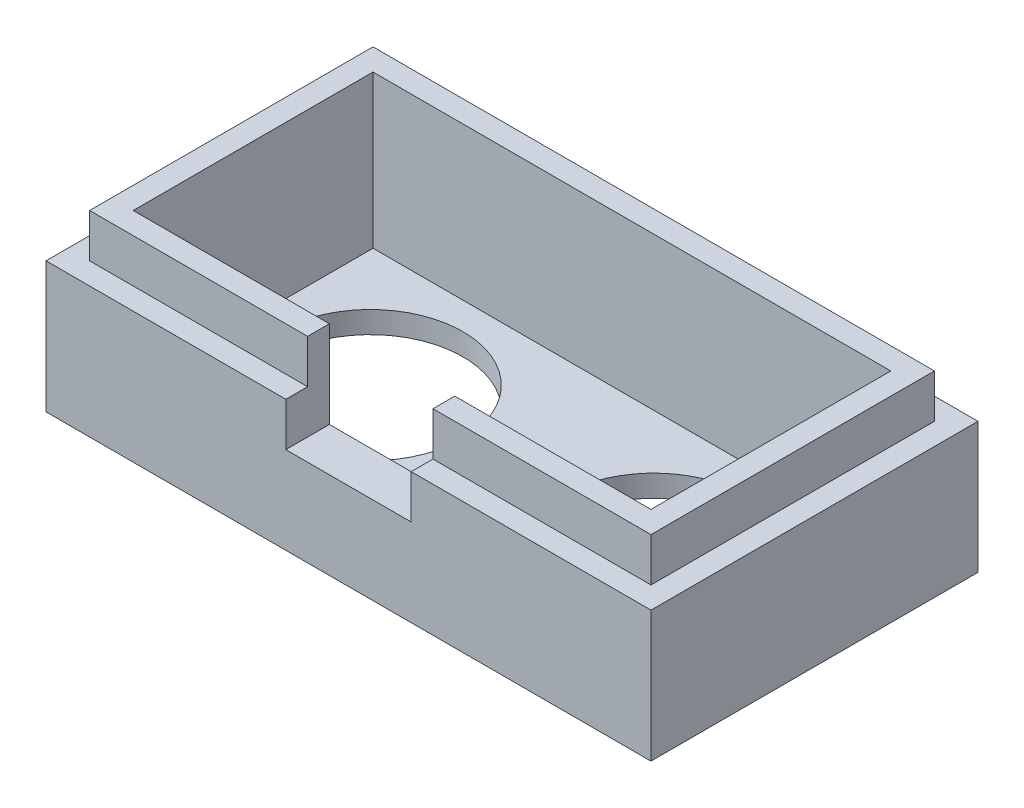
ISO-10303-21;
HEADER;
FILE_DESCRIPTION(('STEP AP214'),'2;1');
FILE_NAME('part.step','',(''),(''),'','','');
FILE_SCHEMA(('AUTOMOTIVE_DESIGN { 1 0 10303 214 1 1 1 1 }'));
ENDSEC;
DATA;
#1=APPLICATION_CONTEXT('core data for automotive mechanical design processes');
#2=APPLICATION_PROTOCOL_DEFINITION('international standard','automotive_design',2000,#1);
#3=PRODUCT_CONTEXT('',#1,'mechanical');
#4=PRODUCT('Part','Part','',(#3));
#5=PRODUCT_RELATED_PRODUCT_CATEGORY('part','',(#4));
#6=PRODUCT_DEFINITION_FORMATION('','',#4);
#7=PRODUCT_DEFINITION_CONTEXT('part definition',#1,'design');
#8=PRODUCT_DEFINITION('design','',#6,#7);
#9=PRODUCT_DEFINITION_SHAPE('','',#8);
#10=(LENGTH_UNIT() NAMED_UNIT(*) SI_UNIT(.MILLI.,.METRE.));
#11=(NAMED_UNIT(*) PLANE_ANGLE_UNIT() SI_UNIT($,.RADIAN.));
#12=(NAMED_UNIT(*) SI_UNIT($,.STERADIAN.) SOLID_ANGLE_UNIT());
#13=UNCERTAINTY_MEASURE_WITH_UNIT(LENGTH_MEASURE(1.E-05),#10,'distance_accuracy_value','');
#14=(GEOMETRIC_REPRESENTATION_CONTEXT(3) GLOBAL_UNCERTAINTY_ASSIGNED_CONTEXT((#13)) GLOBAL_UNIT_ASSIGNED_CONTEXT((#10,
#11,#12)) REPRESENTATION_CONTEXT('',''));
#15=CARTESIAN_POINT('',(0.,0.,0.));
#16=DIRECTION('',(0.,0.,1.));
#17=DIRECTION('',(1.,0.,0.));
#18=AXIS2_PLACEMENT_3D('',#15,#16,#17);
#19=CARTESIAN_POINT('',(0.,16.,13.));
#20=DIRECTION('',(0.,0.,1.));
#21=DIRECTION('',(1.,0.,0.));
#22=AXIS2_PLACEMENT_3D('',#19,#20,#21);
#23=PLANE('',#22);
#24=DIRECTION('',(0.,-1.,0.));
#25=VECTOR('',#24,1.);
#26=CARTESIAN_POINT('',(-5.75,16.,13.));
#27=LINE('',#26,#25);
#28=CARTESIAN_POINT('',(-5.75,16.,13.));
#29=VERTEX_POINT('',#28);
#30=CARTESIAN_POINT('',(-5.75,12.,13.));
#31=VERTEX_POINT('',#30);
#32=EDGE_CURVE('E192',#29,#31,#27,.T.);
#33=ORIENTED_EDGE('',*,*,#32,.F.);
#34=DIRECTION('',(-1.,0.,0.));
#35=VECTOR('',#34,1.);
#36=CARTESIAN_POINT('',(0.,16.,13.));
#37=LINE('',#36,#35);
#38=CARTESIAN_POINT('',(-25.75,16.,13.));
#39=VERTEX_POINT('',#38);
#40=EDGE_CURVE('E251',#29,#39,#37,.T.);
#41=ORIENTED_EDGE('',*,*,#40,.T.);
#42=DIRECTION('',(0.,-1.,0.));
#43=VECTOR('',#42,1.);
#44=CARTESIAN_POINT('',(-25.75,16.,13.));
#45=LINE('',#44,#43);
#46=CARTESIAN_POINT('',(-25.75,12.,13.));
#47=VERTEX_POINT('',#46);
#48=EDGE_CURVE('E264',#39,#47,#45,.T.);
#49=ORIENTED_EDGE('',*,*,#48,.T.);
#50=DIRECTION('',(-1.,0.,0.));
#51=VECTOR('',#50,1.);
#52=CARTESIAN_POINT('',(0.,12.,13.));
#53=LINE('',#52,#51);
#54=EDGE_CURVE('E200',#31,#47,#53,.T.);
#55=ORIENTED_EDGE('',*,*,#54,.F.);
#56=EDGE_LOOP('',(#33,#41,#49,#55));
#57=FACE_BOUND('',#56,.T.);
#58=ADVANCED_FACE('F32',(#57),#23,.T.);
#59=CARTESIAN_POINT('',(-13.,2.,0.));
#60=DIRECTION('',(0.,-1.,0.));
#61=DIRECTION('',(0.,0.,-1.));
#62=AXIS2_PLACEMENT_3D('',#59,#60,#61);
#63=CYLINDRICAL_SURFACE('',#62,8.5);
#64=CARTESIAN_POINT('',(-13.,2.,0.));
#65=DIRECTION('',(0.,1.,0.));
#66=DIRECTION('',(0.,0.,1.));
#67=AXIS2_PLACEMENT_3D('',#64,#65,#66);
#68=CIRCLE('',#67,8.5);
#69=CARTESIAN_POINT('',(-13.,2.,8.5));
#70=VERTEX_POINT('',#69);
#71=EDGE_CURVE('E296',#70,#70,#68,.T.);
#72=ORIENTED_EDGE('',*,*,#71,.T.);
#73=EDGE_LOOP('',(#72));
#74=FACE_BOUND('',#73,.T.);
#75=CARTESIAN_POINT('',(-13.,0.,0.));
#76=DIRECTION('',(0.,1.,0.));
#77=DIRECTION('',(0.,0.,1.));
#78=AXIS2_PLACEMENT_3D('',#75,#76,#77);
#79=CIRCLE('',#78,8.5);
#80=CARTESIAN_POINT('',(-13.,0.,8.5));
#81=VERTEX_POINT('',#80);
#82=EDGE_CURVE('E275',#81,#81,#79,.T.);
#83=ORIENTED_EDGE('',*,*,#82,.F.);
#84=EDGE_LOOP('',(#83));
#85=FACE_BOUND('',#84,.T.);
#86=ADVANCED_FACE('F34',(#74,#85),#63,.F.);
#87=CARTESIAN_POINT('',(13.,2.,0.));
#88=DIRECTION('',(0.,-1.,0.));
#89=DIRECTION('',(0.,0.,-1.));
#90=AXIS2_PLACEMENT_3D('',#87,#88,#89);
#91=CYLINDRICAL_SURFACE('',#90,8.5);
#92=CARTESIAN_POINT('',(13.,2.,0.));
#93=DIRECTION('',(0.,1.,0.));
#94=DIRECTION('',(0.,0.,1.));
#95=AXIS2_PLACEMENT_3D('',#92,#93,#94);
#96=CIRCLE('',#95,8.5);
#97=CARTESIAN_POINT('',(13.,2.,8.5));
#98=VERTEX_POINT('',#97);
#99=EDGE_CURVE('E299',#98,#98,#96,.F.);
#100=ORIENTED_EDGE('',*,*,#99,.F.);
#101=EDGE_LOOP('',(#100));
#102=FACE_BOUND('',#101,.T.);
#103=CARTESIAN_POINT('',(13.,0.,0.));
#104=DIRECTION('',(0.,1.,0.));
#105=DIRECTION('',(0.,0.,1.));
#106=AXIS2_PLACEMENT_3D('',#103,#104,#105);
#107=CIRCLE('',#106,8.5);
#108=CARTESIAN_POINT('',(13.,0.,8.5));
#109=VERTEX_POINT('',#108);
#110=EDGE_CURVE('E288',#109,#109,#107,.F.);
#111=ORIENTED_EDGE('',*,*,#110,.T.);
#112=EDGE_LOOP('',(#111));
#113=FACE_BOUND('',#112,.T.);
#114=ADVANCED_FACE('F368',(#102,#113),#91,.F.);
#115=CARTESIAN_POINT('',(0.,2.,0.));
#116=DIRECTION('',(0.,1.,0.));
#117=DIRECTION('',(0.,0.,1.));
#118=AXIS2_PLACEMENT_3D('',#115,#116,#117);
#119=PLANE('',#118);
#120=DIRECTION('',(0.,0.,-1.));
#121=VECTOR('',#120,1.);
#122=CARTESIAN_POINT('',(-23.75,2.,0.));
#123=LINE('',#122,#121);
#124=CARTESIAN_POINT('',(-23.75,2.,11.));
#125=VERTEX_POINT('',#124);
#126=CARTESIAN_POINT('',(-23.75,2.,-11.));
#127=VERTEX_POINT('',#126);
#128=EDGE_CURVE('E285',#125,#127,#123,.T.);
#129=ORIENTED_EDGE('',*,*,#128,.F.);
#130=DIRECTION('',(-1.,0.,0.));
#131=VECTOR('',#130,1.);
#132=CARTESIAN_POINT('',(0.,2.,11.));
#133=LINE('',#132,#131);
#134=CARTESIAN_POINT('',(23.75,2.,11.));
#135=VERTEX_POINT('',#134);
#136=EDGE_CURVE('E287',#135,#125,#133,.T.);
#137=ORIENTED_EDGE('',*,*,#136,.F.);
#138=DIRECTION('',(0.,0.,-1.));
#139=VECTOR('',#138,1.);
#140=CARTESIAN_POINT('',(23.75,2.,0.));
#141=LINE('',#140,#139);
#142=CARTESIAN_POINT('',(23.75,2.,-11.));
#143=VERTEX_POINT('',#142);
#144=EDGE_CURVE('E290',#135,#143,#141,.T.);
#145=ORIENTED_EDGE('',*,*,#144,.T.);
#146=DIRECTION('',(-1.,0.,0.));
#147=VECTOR('',#146,1.);
#148=CARTESIAN_POINT('',(0.,2.,-11.));
#149=LINE('',#148,#147);
#150=EDGE_CURVE('E293',#143,#127,#149,.T.);
#151=ORIENTED_EDGE('',*,*,#150,.T.);
#152=EDGE_LOOP('',(#129,#137,#145,#151));
#153=FACE_BOUND('',#152,.T.);
#154=ORIENTED_EDGE('',*,*,#71,.F.);
#155=EDGE_LOOP('',(#154));
#156=FACE_BOUND('',#155,.T.);
#157=ORIENTED_EDGE('',*,*,#99,.T.);
#158=EDGE_LOOP('',(#157));
#159=FACE_BOUND('',#158,.T.);
#160=ADVANCED_FACE('F377',(#153,#156,#159),#119,.T.);
#161=CARTESIAN_POINT('',(0.,0.,0.));
#162=DIRECTION('',(0.,1.,0.));
#163=DIRECTION('',(0.,0.,1.));
#164=AXIS2_PLACEMENT_3D('',#161,#162,#163);
#165=PLANE('',#164);
#166=ORIENTED_EDGE('',*,*,#82,.T.);
#167=EDGE_LOOP('',(#166));
#168=FACE_BOUND('',#167,.T.);
#169=ORIENTED_EDGE('',*,*,#110,.F.);
#170=EDGE_LOOP('',(#169));
#171=FACE_BOUND('',#170,.T.);
#172=DIRECTION('',(-1.,0.,0.));
#173=VECTOR('',#172,1.);
#174=CARTESIAN_POINT('',(0.,0.,15.));
#175=LINE('',#174,#173);
#176=CARTESIAN_POINT('',(27.75,0.,15.));
#177=VERTEX_POINT('',#176);
#178=CARTESIAN_POINT('',(-27.75,0.,15.));
#179=VERTEX_POINT('',#178);
#180=EDGE_CURVE('E197',#177,#179,#175,.T.);
#181=ORIENTED_EDGE('',*,*,#180,.T.);
#182=DIRECTION('',(0.,0.,-1.));
#183=VECTOR('',#182,1.);
#184=CARTESIAN_POINT('',(-27.75,0.,0.));
#185=LINE('',#184,#183);
#186=CARTESIAN_POINT('',(-27.75,0.,-15.));
#187=VERTEX_POINT('',#186);
#188=EDGE_CURVE('E201',#179,#187,#185,.T.);
#189=ORIENTED_EDGE('',*,*,#188,.T.);
#190=DIRECTION('',(-1.,0.,0.));
#191=VECTOR('',#190,1.);
#192=CARTESIAN_POINT('',(0.,0.,-15.));
#193=LINE('',#192,#191);
#194=CARTESIAN_POINT('',(27.75,0.,-15.));
#195=VERTEX_POINT('',#194);
#196=EDGE_CURVE('E226',#195,#187,#193,.T.);
#197=ORIENTED_EDGE('',*,*,#196,.F.);
#198=DIRECTION('',(0.,0.,-1.));
#199=VECTOR('',#198,1.);
#200=CARTESIAN_POINT('',(27.75,0.,0.));
#201=LINE('',#200,#199);
#202=EDGE_CURVE('E223',#177,#195,#201,.T.);
#203=ORIENTED_EDGE('',*,*,#202,.F.);
#204=EDGE_LOOP('',(#181,#189,#197,#203));
#205=FACE_BOUND('',#204,.T.);
#206=ADVANCED_FACE('F347',(#168,#171,#205),#165,.F.);
#207=DIRECTION('',(0.,1.,0.));
#208=VECTOR('',#207,1.);
#209=CARTESIAN_POINT('',(5.75,16.,13.));
#210=LINE('',#209,#208);
#211=CARTESIAN_POINT('',(5.75,12.,13.));
#212=VERTEX_POINT('',#211);
#213=CARTESIAN_POINT('',(5.75,16.,13.));
#214=VERTEX_POINT('',#213);
#215=EDGE_CURVE('E183',#212,#214,#210,.T.);
#216=ORIENTED_EDGE('',*,*,#215,.F.);
#217=CARTESIAN_POINT('',(25.75,12.,13.));
#218=VERTEX_POINT('',#217);
#219=EDGE_CURVE('E55',#218,#212,#53,.T.);
#220=ORIENTED_EDGE('',*,*,#219,.F.);
#221=DIRECTION('',(0.,-1.,0.));
#222=VECTOR('',#221,1.);
#223=CARTESIAN_POINT('',(25.75,16.,13.));
#224=LINE('',#223,#222);
#225=CARTESIAN_POINT('',(25.75,16.,13.));
#226=VERTEX_POINT('',#225);
#227=EDGE_CURVE('E273',#226,#218,#224,.T.);
#228=ORIENTED_EDGE('',*,*,#227,.F.);
#229=EDGE_CURVE('E252',#226,#214,#37,.T.);
#230=ORIENTED_EDGE('',*,*,#229,.T.);
#231=EDGE_LOOP('',(#216,#220,#228,#230));
#232=FACE_BOUND('',#231,.T.);
#233=ADVANCED_FACE('F308',(#232),#23,.T.);
#234=CARTESIAN_POINT('',(25.75,16.,0.));
#235=DIRECTION('',(-1.,0.,0.));
#236=DIRECTION('',(0.,0.,1.));
#237=AXIS2_PLACEMENT_3D('',#234,#235,#236);
#238=PLANE('',#237);
#239=ORIENTED_EDGE('',*,*,#227,.T.);
#240=DIRECTION('',(0.,0.,-1.));
#241=VECTOR('',#240,1.);
#242=CARTESIAN_POINT('',(25.75,12.,0.));
#243=LINE('',#242,#241);
#244=CARTESIAN_POINT('',(25.75,12.,-13.));
#245=VERTEX_POINT('',#244);
#246=EDGE_CURVE('E198',#218,#245,#243,.T.);
#247=ORIENTED_EDGE('',*,*,#246,.T.);
#248=DIRECTION('',(0.,-1.,0.));
#249=VECTOR('',#248,1.);
#250=CARTESIAN_POINT('',(25.75,16.,-13.));
#251=LINE('',#250,#249);
#252=CARTESIAN_POINT('',(25.75,16.,-13.));
#253=VERTEX_POINT('',#252);
#254=EDGE_CURVE('E270',#253,#245,#251,.T.);
#255=ORIENTED_EDGE('',*,*,#254,.F.);
#256=DIRECTION('',(0.,0.,-1.));
#257=VECTOR('',#256,1.);
#258=CARTESIAN_POINT('',(25.75,16.,0.));
#259=LINE('',#258,#257);
#260=EDGE_CURVE('E255',#226,#253,#259,.T.);
#261=ORIENTED_EDGE('',*,*,#260,.F.);
#262=EDGE_LOOP('',(#239,#247,#255,#261));
#263=FACE_BOUND('',#262,.T.);
#264=ADVANCED_FACE('F315',(#263),#238,.F.);
#265=CARTESIAN_POINT('',(0.,16.,-13.));
#266=DIRECTION('',(0.,0.,1.));
#267=DIRECTION('',(1.,0.,0.));
#268=AXIS2_PLACEMENT_3D('',#265,#266,#267);
#269=PLANE('',#268);
#270=ORIENTED_EDGE('',*,*,#254,.T.);
#271=DIRECTION('',(-1.,0.,0.));
#272=VECTOR('',#271,1.);
#273=CARTESIAN_POINT('',(0.,12.,-13.));
#274=LINE('',#273,#272);
#275=CARTESIAN_POINT('',(-25.75,12.,-13.));
#276=VERTEX_POINT('',#275);
#277=EDGE_CURVE('E206',#245,#276,#274,.T.);
#278=ORIENTED_EDGE('',*,*,#277,.T.);
#279=DIRECTION('',(0.,-1.,0.));
#280=VECTOR('',#279,1.);
#281=CARTESIAN_POINT('',(-25.75,16.,-13.));
#282=LINE('',#281,#280);
#283=CARTESIAN_POINT('',(-25.75,16.,-13.));
#284=VERTEX_POINT('',#283);
#285=EDGE_CURVE('E267',#284,#276,#282,.T.);
#286=ORIENTED_EDGE('',*,*,#285,.F.);
#287=DIRECTION('',(-1.,0.,0.));
#288=VECTOR('',#287,1.);
#289=CARTESIAN_POINT('',(0.,16.,-13.));
#290=LINE('',#289,#288);
#291=EDGE_CURVE('E258',#253,#284,#290,.T.);
#292=ORIENTED_EDGE('',*,*,#291,.F.);
#293=EDGE_LOOP('',(#270,#278,#286,#292));
#294=FACE_BOUND('',#293,.T.);
#295=ADVANCED_FACE('F318',(#294),#269,.F.);
#296=CARTESIAN_POINT('',(0.,16.,11.));
#297=DIRECTION('',(0.,0.,1.));
#298=DIRECTION('',(1.,0.,0.));
#299=AXIS2_PLACEMENT_3D('',#296,#297,#298);
#300=PLANE('',#299);
#301=DIRECTION('',(-1.,0.,0.));
#302=VECTOR('',#301,1.);
#303=CARTESIAN_POINT('',(0.,16.,11.));
#304=LINE('',#303,#302);
#305=CARTESIAN_POINT('',(-5.75,16.,11.));
#306=VERTEX_POINT('',#305);
#307=CARTESIAN_POINT('',(-23.75,16.,11.));
#308=VERTEX_POINT('',#307);
#309=EDGE_CURVE('E239',#306,#308,#304,.T.);
#310=ORIENTED_EDGE('',*,*,#309,.F.);
#311=DIRECTION('',(0.,-1.,0.));
#312=VECTOR('',#311,1.);
#313=CARTESIAN_POINT('',(-5.75,16.,11.));
#314=LINE('',#313,#312);
#315=CARTESIAN_POINT('',(-5.75,8.00000000000001,11.));
#316=VERTEX_POINT('',#315);
#317=EDGE_CURVE('E194',#306,#316,#314,.T.);
#318=ORIENTED_EDGE('',*,*,#317,.T.);
#319=DIRECTION('',(1.,0.,0.));
#320=VECTOR('',#319,1.);
#321=CARTESIAN_POINT('',(0.,8.00000000000001,11.));
#322=LINE('',#321,#320);
#323=CARTESIAN_POINT('',(5.75,8.00000000000001,11.));
#324=VERTEX_POINT('',#323);
#325=EDGE_CURVE('E164',#316,#324,#322,.T.);
#326=ORIENTED_EDGE('',*,*,#325,.T.);
#327=DIRECTION('',(0.,1.,0.));
#328=VECTOR('',#327,1.);
#329=CARTESIAN_POINT('',(5.75,16.,11.));
#330=LINE('',#329,#328);
#331=CARTESIAN_POINT('',(5.75,16.,11.));
#332=VERTEX_POINT('',#331);
#333=EDGE_CURVE('E189',#324,#332,#330,.T.);
#334=ORIENTED_EDGE('',*,*,#333,.T.);
#335=CARTESIAN_POINT('',(23.75,16.,11.));
#336=VERTEX_POINT('',#335);
#337=EDGE_CURVE('E240',#336,#332,#304,.T.);
#338=ORIENTED_EDGE('',*,*,#337,.F.);
#339=DIRECTION('',(0.,-1.,0.));
#340=VECTOR('',#339,1.);
#341=CARTESIAN_POINT('',(23.75,16.,11.));
#342=LINE('',#341,#340);
#343=EDGE_CURVE('E263',#336,#135,#342,.T.);
#344=ORIENTED_EDGE('',*,*,#343,.T.);
#345=ORIENTED_EDGE('',*,*,#136,.T.);
#346=DIRECTION('',(0.,-1.,0.));
#347=VECTOR('',#346,1.);
#348=CARTESIAN_POINT('',(-23.75,16.,11.));
#349=LINE('',#348,#347);
#350=EDGE_CURVE('E268',#308,#125,#349,.T.);
#351=ORIENTED_EDGE('',*,*,#350,.F.);
#352=EDGE_LOOP('',(#310,#318,#326,#334,#338,#344,#345,#351));
#353=FACE_BOUND('',#352,.T.);
#354=ADVANCED_FACE('F328',(#353),#300,.F.);
#355=CARTESIAN_POINT('',(-23.75,16.,0.));
#356=DIRECTION('',(-1.,0.,0.));
#357=DIRECTION('',(0.,0.,1.));
#358=AXIS2_PLACEMENT_3D('',#355,#356,#357);
#359=PLANE('',#358);
#360=ORIENTED_EDGE('',*,*,#128,.T.);
#361=DIRECTION('',(0.,-1.,0.));
#362=VECTOR('',#361,1.);
#363=CARTESIAN_POINT('',(-23.75,16.,-11.));
#364=LINE('',#363,#362);
#365=CARTESIAN_POINT('',(-23.75,16.,-11.));
#366=VERTEX_POINT('',#365);
#367=EDGE_CURVE('E280',#366,#127,#364,.T.);
#368=ORIENTED_EDGE('',*,*,#367,.F.);
#369=DIRECTION('',(0.,0.,-1.));
#370=VECTOR('',#369,1.);
#371=CARTESIAN_POINT('',(-23.75,16.,0.));
#372=LINE('',#371,#370);
#373=EDGE_CURVE('E243',#308,#366,#372,.T.);
#374=ORIENTED_EDGE('',*,*,#373,.F.);
#375=ORIENTED_EDGE('',*,*,#350,.T.);
#376=EDGE_LOOP('',(#360,#368,#374,#375));
#377=FACE_BOUND('',#376,.T.);
#378=ADVANCED_FACE('F407',(#377),#359,.F.);
#379=CARTESIAN_POINT('',(0.,16.,-11.));
#380=DIRECTION('',(0.,0.,1.));
#381=DIRECTION('',(1.,0.,0.));
#382=AXIS2_PLACEMENT_3D('',#379,#380,#381);
#383=PLANE('',#382);
#384=ORIENTED_EDGE('',*,*,#367,.T.);
#385=ORIENTED_EDGE('',*,*,#150,.F.);
#386=DIRECTION('',(0.,-1.,0.));
#387=VECTOR('',#386,1.);
#388=CARTESIAN_POINT('',(23.75,16.,-11.));
#389=LINE('',#388,#387);
#390=CARTESIAN_POINT('',(23.75,16.,-11.));
#391=VERTEX_POINT('',#390);
#392=EDGE_CURVE('E278',#391,#143,#389,.T.);
#393=ORIENTED_EDGE('',*,*,#392,.F.);
#394=DIRECTION('',(-1.,0.,0.));
#395=VECTOR('',#394,1.);
#396=CARTESIAN_POINT('',(0.,16.,-11.));
#397=LINE('',#396,#395);
#398=EDGE_CURVE('E245',#391,#366,#397,.T.);
#399=ORIENTED_EDGE('',*,*,#398,.T.);
#400=EDGE_LOOP('',(#384,#385,#393,#399));
#401=FACE_BOUND('',#400,.T.);
#402=ADVANCED_FACE('F412',(#401),#383,.T.);
#403=CARTESIAN_POINT('',(23.75,16.,0.));
#404=DIRECTION('',(-1.,0.,0.));
#405=DIRECTION('',(0.,0.,1.));
#406=AXIS2_PLACEMENT_3D('',#403,#404,#405);
#407=PLANE('',#406);
#408=ORIENTED_EDGE('',*,*,#392,.T.);
#409=ORIENTED_EDGE('',*,*,#144,.F.);
#410=ORIENTED_EDGE('',*,*,#343,.F.);
#411=DIRECTION('',(0.,0.,-1.));
#412=VECTOR('',#411,1.);
#413=CARTESIAN_POINT('',(23.75,16.,0.));
#414=LINE('',#413,#412);
#415=EDGE_CURVE('E248',#336,#391,#414,.T.);
#416=ORIENTED_EDGE('',*,*,#415,.T.);
#417=EDGE_LOOP('',(#408,#409,#410,#416));
#418=FACE_BOUND('',#417,.T.);
#419=ADVANCED_FACE('F424',(#418),#407,.T.);
#420=CARTESIAN_POINT('',(-25.75,16.,0.));
#421=DIRECTION('',(-1.,0.,0.));
#422=DIRECTION('',(0.,0.,1.));
#423=AXIS2_PLACEMENT_3D('',#420,#421,#422);
#424=PLANE('',#423);
#425=DIRECTION('',(0.,0.,-1.));
#426=VECTOR('',#425,1.);
#427=CARTESIAN_POINT('',(-25.75,12.,0.));
#428=LINE('',#427,#426);
#429=EDGE_CURVE('E203',#47,#276,#428,.T.);
#430=ORIENTED_EDGE('',*,*,#429,.F.);
#431=ORIENTED_EDGE('',*,*,#48,.F.);
#432=DIRECTION('',(0.,0.,-1.));
#433=VECTOR('',#432,1.);
#434=CARTESIAN_POINT('',(-25.75,16.,0.));
#435=LINE('',#434,#433);
#436=EDGE_CURVE('E260',#39,#284,#435,.T.);
#437=ORIENTED_EDGE('',*,*,#436,.T.);
#438=ORIENTED_EDGE('',*,*,#285,.T.);
#439=EDGE_LOOP('',(#430,#431,#437,#438));
#440=FACE_BOUND('',#439,.T.);
#441=ADVANCED_FACE('F338',(#440),#424,.T.);
#442=CARTESIAN_POINT('',(0.,16.,0.));
#443=DIRECTION('',(0.,1.,0.));
#444=DIRECTION('',(0.,0.,1.));
#445=AXIS2_PLACEMENT_3D('',#442,#443,#444);
#446=PLANE('',#445);
#447=DIRECTION('',(0.,0.,1.));
#448=VECTOR('',#447,1.);
#449=CARTESIAN_POINT('',(-5.75,16.,3.));
#450=LINE('',#449,#448);
#451=EDGE_CURVE('E181',#306,#29,#450,.T.);
#452=ORIENTED_EDGE('',*,*,#451,.F.);
#453=ORIENTED_EDGE('',*,*,#309,.T.);
#454=ORIENTED_EDGE('',*,*,#373,.T.);
#455=ORIENTED_EDGE('',*,*,#398,.F.);
#456=ORIENTED_EDGE('',*,*,#415,.F.);
#457=ORIENTED_EDGE('',*,*,#337,.T.);
#458=DIRECTION('',(0.,0.,1.));
#459=VECTOR('',#458,1.);
#460=CARTESIAN_POINT('',(5.75,16.,3.));
#461=LINE('',#460,#459);
#462=EDGE_CURVE('E184',#332,#214,#461,.T.);
#463=ORIENTED_EDGE('',*,*,#462,.T.);
#464=ORIENTED_EDGE('',*,*,#229,.F.);
#465=ORIENTED_EDGE('',*,*,#260,.T.);
#466=ORIENTED_EDGE('',*,*,#291,.T.);
#467=ORIENTED_EDGE('',*,*,#436,.F.);
#468=ORIENTED_EDGE('',*,*,#40,.F.);
#469=EDGE_LOOP('',(#452,#453,#454,#455,#456,#457,#463,#464,#465,#466,#467,#468));
#470=FACE_BOUND('',#469,.T.);
#471=ADVANCED_FACE('F323',(#470),#446,.T.);
#472=CARTESIAN_POINT('',(0.,12.,15.));
#473=DIRECTION('',(0.,0.,1.));
#474=DIRECTION('',(1.,0.,0.));
#475=AXIS2_PLACEMENT_3D('',#472,#473,#474);
#476=PLANE('',#475);
#477=DIRECTION('',(0.,-1.,0.));
#478=VECTOR('',#477,1.);
#479=CARTESIAN_POINT('',(-5.75,8.00000000000001,15.));
#480=LINE('',#479,#478);
#481=CARTESIAN_POINT('',(-5.75,12.,15.));
#482=VERTEX_POINT('',#481);
#483=CARTESIAN_POINT('',(-5.75,8.00000000000001,15.));
#484=VERTEX_POINT('',#483);
#485=EDGE_CURVE('E170',#482,#484,#480,.T.);
#486=ORIENTED_EDGE('',*,*,#485,.F.);
#487=DIRECTION('',(-1.,0.,0.));
#488=VECTOR('',#487,1.);
#489=CARTESIAN_POINT('',(0.,12.,15.));
#490=LINE('',#489,#488);
#491=CARTESIAN_POINT('',(-27.75,12.,15.));
#492=VERTEX_POINT('',#491);
#493=EDGE_CURVE('E209',#482,#492,#490,.T.);
#494=ORIENTED_EDGE('',*,*,#493,.T.);
#495=DIRECTION('',(0.,-1.,0.));
#496=VECTOR('',#495,1.);
#497=CARTESIAN_POINT('',(-27.75,12.,15.));
#498=LINE('',#497,#496);
#499=EDGE_CURVE('E220',#492,#179,#498,.T.);
#500=ORIENTED_EDGE('',*,*,#499,.T.);
#501=ORIENTED_EDGE('',*,*,#180,.F.);
#502=DIRECTION('',(0.,-1.,0.));
#503=VECTOR('',#502,1.);
#504=CARTESIAN_POINT('',(27.75,12.,15.));
#505=LINE('',#504,#503);
#506=CARTESIAN_POINT('',(27.75,12.,15.));
#507=VERTEX_POINT('',#506);
#508=EDGE_CURVE('E237',#507,#177,#505,.T.);
#509=ORIENTED_EDGE('',*,*,#508,.F.);
#510=CARTESIAN_POINT('',(5.75,12.,15.));
#511=VERTEX_POINT('',#510);
#512=EDGE_CURVE('E210',#507,#511,#490,.T.);
#513=ORIENTED_EDGE('',*,*,#512,.T.);
#514=DIRECTION('',(0.,1.,0.));
#515=VECTOR('',#514,1.);
#516=CARTESIAN_POINT('',(5.75,8.00000000000001,15.));
#517=LINE('',#516,#515);
#518=CARTESIAN_POINT('',(5.75,8.00000000000001,15.));
#519=VERTEX_POINT('',#518);
#520=EDGE_CURVE('E47',#519,#511,#517,.T.);
#521=ORIENTED_EDGE('',*,*,#520,.F.);
#522=DIRECTION('',(1.,0.,0.));
#523=VECTOR('',#522,1.);
#524=CARTESIAN_POINT('',(5.75,8.00000000000001,15.));
#525=LINE('',#524,#523);
#526=EDGE_CURVE('E162',#484,#519,#525,.T.);
#527=ORIENTED_EDGE('',*,*,#526,.F.);
#528=EDGE_LOOP('',(#486,#494,#500,#501,#509,#513,#521,#527));
#529=FACE_BOUND('',#528,.T.);
#530=ADVANCED_FACE('F176',(#529),#476,.T.);
#531=CARTESIAN_POINT('',(27.75,12.,0.));
#532=DIRECTION('',(-1.,0.,0.));
#533=DIRECTION('',(0.,0.,1.));
#534=AXIS2_PLACEMENT_3D('',#531,#532,#533);
#535=PLANE('',#534);
#536=ORIENTED_EDGE('',*,*,#202,.T.);
#537=DIRECTION('',(0.,-1.,0.));
#538=VECTOR('',#537,1.);
#539=CARTESIAN_POINT('',(27.75,12.,-15.));
#540=LINE('',#539,#538);
#541=CARTESIAN_POINT('',(27.75,12.,-15.));
#542=VERTEX_POINT('',#541);
#543=EDGE_CURVE('E234',#542,#195,#540,.T.);
#544=ORIENTED_EDGE('',*,*,#543,.F.);
#545=DIRECTION('',(0.,0.,-1.));
#546=VECTOR('',#545,1.);
#547=CARTESIAN_POINT('',(27.75,12.,0.));
#548=LINE('',#547,#546);
#549=EDGE_CURVE('E212',#507,#542,#548,.T.);
#550=ORIENTED_EDGE('',*,*,#549,.F.);
#551=ORIENTED_EDGE('',*,*,#508,.T.);
#552=EDGE_LOOP('',(#536,#544,#550,#551));
#553=FACE_BOUND('',#552,.T.);
#554=ADVANCED_FACE('F352',(#553),#535,.F.);
#555=CARTESIAN_POINT('',(0.,12.,-15.));
#556=DIRECTION('',(0.,0.,1.));
#557=DIRECTION('',(1.,0.,0.));
#558=AXIS2_PLACEMENT_3D('',#555,#556,#557);
#559=PLANE('',#558);
#560=ORIENTED_EDGE('',*,*,#196,.T.);
#561=DIRECTION('',(0.,-1.,0.));
#562=VECTOR('',#561,1.);
#563=CARTESIAN_POINT('',(-27.75,12.,-15.));
#564=LINE('',#563,#562);
#565=CARTESIAN_POINT('',(-27.75,12.,-15.));
#566=VERTEX_POINT('',#565);
#567=EDGE_CURVE('E232',#566,#187,#564,.T.);
#568=ORIENTED_EDGE('',*,*,#567,.F.);
#569=DIRECTION('',(-1.,0.,0.));
#570=VECTOR('',#569,1.);
#571=CARTESIAN_POINT('',(0.,12.,-15.));
#572=LINE('',#571,#570);
#573=EDGE_CURVE('E215',#542,#566,#572,.T.);
#574=ORIENTED_EDGE('',*,*,#573,.F.);
#575=ORIENTED_EDGE('',*,*,#543,.T.);
#576=EDGE_LOOP('',(#560,#568,#574,#575));
#577=FACE_BOUND('',#576,.T.);
#578=ADVANCED_FACE('F354',(#577),#559,.F.);
#579=CARTESIAN_POINT('',(-27.75,12.,0.));
#580=DIRECTION('',(-1.,0.,0.));
#581=DIRECTION('',(0.,0.,1.));
#582=AXIS2_PLACEMENT_3D('',#579,#580,#581);
#583=PLANE('',#582);
#584=ORIENTED_EDGE('',*,*,#188,.F.);
#585=ORIENTED_EDGE('',*,*,#499,.F.);
#586=DIRECTION('',(0.,0.,-1.));
#587=VECTOR('',#586,1.);
#588=CARTESIAN_POINT('',(-27.75,12.,0.));
#589=LINE('',#588,#587);
#590=EDGE_CURVE('E217',#492,#566,#589,.T.);
#591=ORIENTED_EDGE('',*,*,#590,.T.);
#592=ORIENTED_EDGE('',*,*,#567,.T.);
#593=EDGE_LOOP('',(#584,#585,#591,#592));
#594=FACE_BOUND('',#593,.T.);
#595=ADVANCED_FACE('F344',(#594),#583,.T.);
#596=CARTESIAN_POINT('',(0.,12.,0.));
#597=DIRECTION('',(0.,1.,0.));
#598=DIRECTION('',(0.,0.,1.));
#599=AXIS2_PLACEMENT_3D('',#596,#597,#598);
#600=PLANE('',#599);
#601=DIRECTION('',(0.,0.,1.));
#602=VECTOR('',#601,1.);
#603=CARTESIAN_POINT('',(-5.75,12.,0.));
#604=LINE('',#603,#602);
#605=EDGE_CURVE('E11',#31,#482,#604,.T.);
#606=ORIENTED_EDGE('',*,*,#605,.F.);
#607=ORIENTED_EDGE('',*,*,#54,.T.);
#608=ORIENTED_EDGE('',*,*,#429,.T.);
#609=ORIENTED_EDGE('',*,*,#277,.F.);
#610=ORIENTED_EDGE('',*,*,#246,.F.);
#611=ORIENTED_EDGE('',*,*,#219,.T.);
#612=DIRECTION('',(0.,0.,-1.));
#613=VECTOR('',#612,1.);
#614=CARTESIAN_POINT('',(5.75,12.,0.));
#615=LINE('',#614,#613);
#616=EDGE_CURVE('E40',#511,#212,#615,.T.);
#617=ORIENTED_EDGE('',*,*,#616,.F.);
#618=ORIENTED_EDGE('',*,*,#512,.F.);
#619=ORIENTED_EDGE('',*,*,#549,.T.);
#620=ORIENTED_EDGE('',*,*,#573,.T.);
#621=ORIENTED_EDGE('',*,*,#590,.F.);
#622=ORIENTED_EDGE('',*,*,#493,.F.);
#623=EDGE_LOOP('',(#606,#607,#608,#609,#610,#611,#617,#618,#619,#620,#621,#622));
#624=FACE_BOUND('',#623,.T.);
#625=ADVANCED_FACE('F311',(#624),#600,.T.);
#626=CARTESIAN_POINT('',(5.75,8.00000000000001,3.));
#627=DIRECTION('',(0.,-1.,0.));
#628=DIRECTION('',(1.,0.,0.));
#629=AXIS2_PLACEMENT_3D('',#626,#627,#628);
#630=PLANE('',#629);
#631=DIRECTION('',(0.,0.,1.));
#632=VECTOR('',#631,1.);
#633=CARTESIAN_POINT('',(-5.75,8.00000000000001,3.));
#634=LINE('',#633,#632);
#635=EDGE_CURVE('E157',#316,#484,#634,.T.);
#636=ORIENTED_EDGE('',*,*,#635,.T.);
#637=ORIENTED_EDGE('',*,*,#526,.T.);
#638=DIRECTION('',(0.,0.,1.));
#639=VECTOR('',#638,1.);
#640=CARTESIAN_POINT('',(5.75,8.00000000000001,3.));
#641=LINE('',#640,#639);
#642=EDGE_CURVE('E167',#324,#519,#641,.T.);
#643=ORIENTED_EDGE('',*,*,#642,.F.);
#644=ORIENTED_EDGE('',*,*,#325,.F.);
#645=EDGE_LOOP('',(#636,#637,#643,#644));
#646=FACE_BOUND('',#645,.T.);
#647=ADVANCED_FACE('F159',(#646),#630,.F.);
#648=CARTESIAN_POINT('',(-5.75,8.00000000000001,3.));
#649=DIRECTION('',(-1.,0.,0.));
#650=DIRECTION('',(0.,0.,1.));
#651=AXIS2_PLACEMENT_3D('',#648,#649,#650);
#652=PLANE('',#651);
#653=ORIENTED_EDGE('',*,*,#451,.T.);
#654=ORIENTED_EDGE('',*,*,#32,.T.);
#655=ORIENTED_EDGE('',*,*,#605,.T.);
#656=ORIENTED_EDGE('',*,*,#485,.T.);
#657=ORIENTED_EDGE('',*,*,#635,.F.);
#658=ORIENTED_EDGE('',*,*,#317,.F.);
#659=EDGE_LOOP('',(#653,#654,#655,#656,#657,#658));
#660=FACE_BOUND('',#659,.T.);
#661=ADVANCED_FACE('F171',(#660),#652,.F.);
#662=CARTESIAN_POINT('',(5.75,8.00000000000001,3.));
#663=DIRECTION('',(1.,0.,0.));
#664=DIRECTION('',(0.,0.,-1.));
#665=AXIS2_PLACEMENT_3D('',#662,#663,#664);
#666=PLANE('',#665);
#667=ORIENTED_EDGE('',*,*,#642,.T.);
#668=ORIENTED_EDGE('',*,*,#520,.T.);
#669=ORIENTED_EDGE('',*,*,#616,.T.);
#670=ORIENTED_EDGE('',*,*,#215,.T.);
#671=ORIENTED_EDGE('',*,*,#462,.F.);
#672=ORIENTED_EDGE('',*,*,#333,.F.);
#673=EDGE_LOOP('',(#667,#668,#669,#670,#671,#672));
#674=FACE_BOUND('',#673,.T.);
#675=ADVANCED_FACE('F305',(#674),#666,.F.);
#676=CLOSED_SHELL('',(#58,#86,#114,#160,#206,#233,#264,#295,#354,#378,#402,#419,#441,#471,#530,
#554,#578,#595,#625,#647,#661,#675));
#677=MANIFOLD_SOLID_BREP('B2',#676);
#678=ADVANCED_BREP_SHAPE_REPRESENTATION('',(#18,#677),#14);
#679=SHAPE_DEFINITION_REPRESENTATION(#9,#678);
ENDSEC;
END-ISO-10303-21;
